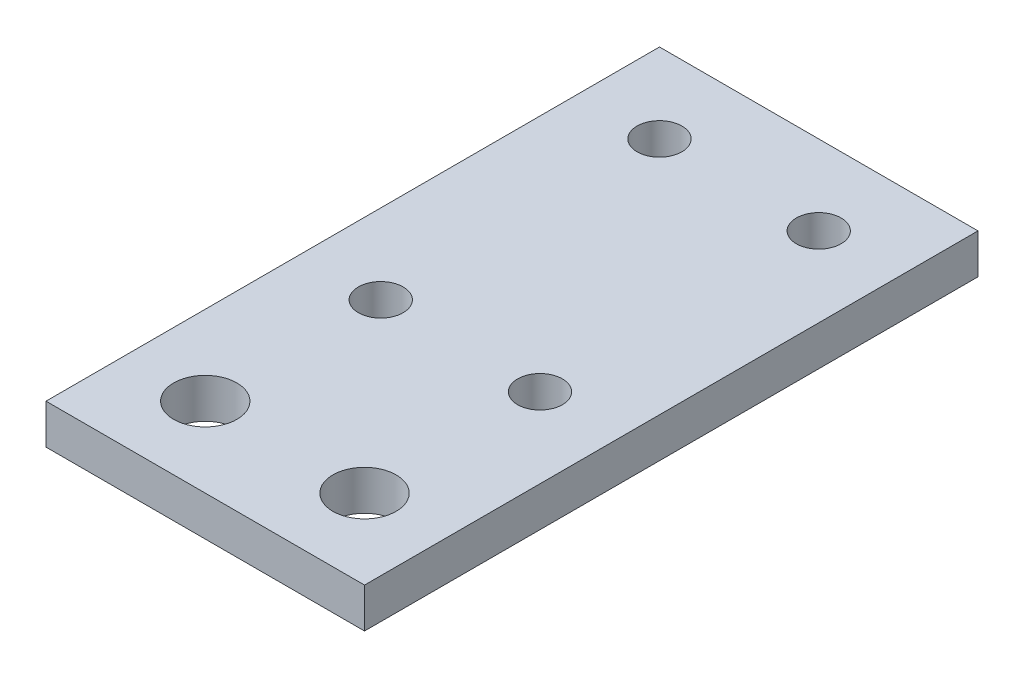
ISO-10303-21;
HEADER;
FILE_DESCRIPTION(('STEP AP214'),'2;1');
FILE_NAME('part.step','',(''),(''),'','','');
FILE_SCHEMA(('AUTOMOTIVE_DESIGN { 1 0 10303 214 1 1 1 1 }'));
ENDSEC;
DATA;
#1=APPLICATION_CONTEXT('core data for automotive mechanical design processes');
#2=APPLICATION_PROTOCOL_DEFINITION('international standard','automotive_design',2000,#1);
#3=PRODUCT_CONTEXT('',#1,'mechanical');
#4=PRODUCT('Part','Part','',(#3));
#5=PRODUCT_RELATED_PRODUCT_CATEGORY('part','',(#4));
#6=PRODUCT_DEFINITION_FORMATION('','',#4);
#7=PRODUCT_DEFINITION_CONTEXT('part definition',#1,'design');
#8=PRODUCT_DEFINITION('design','',#6,#7);
#9=PRODUCT_DEFINITION_SHAPE('','',#8);
#10=(LENGTH_UNIT() NAMED_UNIT(*) SI_UNIT(.MILLI.,.METRE.));
#11=(NAMED_UNIT(*) PLANE_ANGLE_UNIT() SI_UNIT($,.RADIAN.));
#12=(NAMED_UNIT(*) SI_UNIT($,.STERADIAN.) SOLID_ANGLE_UNIT());
#13=UNCERTAINTY_MEASURE_WITH_UNIT(LENGTH_MEASURE(1.E-05),#10,'distance_accuracy_value','');
#14=(GEOMETRIC_REPRESENTATION_CONTEXT(3) GLOBAL_UNCERTAINTY_ASSIGNED_CONTEXT((#13)) GLOBAL_UNIT_ASSIGNED_CONTEXT((#10,
#11,#12)) REPRESENTATION_CONTEXT('',''));
#15=CARTESIAN_POINT('',(0.,0.,0.));
#16=DIRECTION('',(0.,0.,1.));
#17=DIRECTION('',(1.,0.,0.));
#18=AXIS2_PLACEMENT_3D('',#15,#16,#17);
#19=CARTESIAN_POINT('',(25.4,-3.175,97.8408));
#20=DIRECTION('',(-1.,0.,0.));
#21=DIRECTION('',(0.,0.,1.));
#22=AXIS2_PLACEMENT_3D('',#19,#20,#21);
#23=PLANE('',#22);
#24=DIRECTION('',(0.,1.,0.));
#25=VECTOR('',#24,1.);
#26=CARTESIAN_POINT('',(25.4,-3.175,0.));
#27=LINE('',#26,#25);
#28=CARTESIAN_POINT('',(25.4,-3.175,0.));
#29=VERTEX_POINT('',#28);
#30=CARTESIAN_POINT('',(25.4,3.175,0.));
#31=VERTEX_POINT('',#30);
#32=EDGE_CURVE('E105',#29,#31,#27,.T.);
#33=ORIENTED_EDGE('',*,*,#32,.T.);
#34=DIRECTION('',(0.,0.,-1.));
#35=VECTOR('',#34,1.);
#36=CARTESIAN_POINT('',(25.4,3.175,97.8408));
#37=LINE('',#36,#35);
#38=CARTESIAN_POINT('',(25.4,3.175,97.8408));
#39=VERTEX_POINT('',#38);
#40=EDGE_CURVE('E11',#39,#31,#37,.T.);
#41=ORIENTED_EDGE('',*,*,#40,.F.);
#42=DIRECTION('',(0.,1.,0.));
#43=VECTOR('',#42,1.);
#44=CARTESIAN_POINT('',(25.4,-3.175,97.8408));
#45=LINE('',#44,#43);
#46=CARTESIAN_POINT('',(25.4,-3.175,97.8408));
#47=VERTEX_POINT('',#46);
#48=EDGE_CURVE('E92',#47,#39,#45,.T.);
#49=ORIENTED_EDGE('',*,*,#48,.F.);
#50=DIRECTION('',(0.,0.,-1.));
#51=VECTOR('',#50,1.);
#52=CARTESIAN_POINT('',(25.4,-3.175,97.8408));
#53=LINE('',#52,#51);
#54=EDGE_CURVE('E101',#47,#29,#53,.T.);
#55=ORIENTED_EDGE('',*,*,#54,.T.);
#56=EDGE_LOOP('',(#33,#41,#49,#55));
#57=FACE_BOUND('',#56,.T.);
#58=ADVANCED_FACE('F39',(#57),#23,.F.);
#59=CARTESIAN_POINT('',(-25.4,3.175,97.8408));
#60=DIRECTION('',(0.,-1.,0.));
#61=DIRECTION('',(0.,0.,-1.));
#62=AXIS2_PLACEMENT_3D('',#59,#60,#61);
#63=PLANE('',#62);
#64=CARTESIAN_POINT('',(-12.7,3.175,57.15));
#65=DIRECTION('',(0.,1.,0.));
#66=DIRECTION('',(0.,0.,1.));
#67=AXIS2_PLACEMENT_3D('',#64,#65,#66);
#68=CIRCLE('',#67,3.57124);
#69=CARTESIAN_POINT('',(-12.7,3.175,60.72124));
#70=VERTEX_POINT('',#69);
#71=EDGE_CURVE('E134',#70,#70,#68,.T.);
#72=ORIENTED_EDGE('',*,*,#71,.F.);
#73=EDGE_LOOP('',(#72));
#74=FACE_BOUND('',#73,.T.);
#75=CARTESIAN_POINT('',(-12.7,3.175,12.7));
#76=DIRECTION('',(0.,1.,0.));
#77=DIRECTION('',(0.,0.,1.));
#78=AXIS2_PLACEMENT_3D('',#75,#76,#77);
#79=CIRCLE('',#78,3.57124);
#80=CARTESIAN_POINT('',(-12.7,3.175,16.27124));
#81=VERTEX_POINT('',#80);
#82=EDGE_CURVE('E124',#81,#81,#79,.T.);
#83=ORIENTED_EDGE('',*,*,#82,.F.);
#84=EDGE_LOOP('',(#83));
#85=FACE_BOUND('',#84,.T.);
#86=CARTESIAN_POINT('',(-12.7,3.175,85.1408));
#87=DIRECTION('',(0.,1.,0.));
#88=DIRECTION('',(0.,0.,1.));
#89=AXIS2_PLACEMENT_3D('',#86,#87,#88);
#90=CIRCLE('',#89,5.0419);
#91=CARTESIAN_POINT('',(-12.7,3.175,90.1827));
#92=VERTEX_POINT('',#91);
#93=EDGE_CURVE('E121',#92,#92,#90,.T.);
#94=ORIENTED_EDGE('',*,*,#93,.F.);
#95=EDGE_LOOP('',(#94));
#96=FACE_BOUND('',#95,.T.);
#97=CARTESIAN_POINT('',(12.7,3.175,57.15));
#98=DIRECTION('',(0.,1.,0.));
#99=DIRECTION('',(0.,0.,1.));
#100=AXIS2_PLACEMENT_3D('',#97,#98,#99);
#101=CIRCLE('',#100,3.57124);
#102=CARTESIAN_POINT('',(12.7,3.175,60.72124));
#103=VERTEX_POINT('',#102);
#104=EDGE_CURVE('E118',#103,#103,#101,.T.);
#105=ORIENTED_EDGE('',*,*,#104,.F.);
#106=EDGE_LOOP('',(#105));
#107=FACE_BOUND('',#106,.T.);
#108=CARTESIAN_POINT('',(12.7,3.175,12.7));
#109=DIRECTION('',(0.,1.,0.));
#110=DIRECTION('',(0.,0.,1.));
#111=AXIS2_PLACEMENT_3D('',#108,#109,#110);
#112=CIRCLE('',#111,3.57124);
#113=CARTESIAN_POINT('',(12.7,3.175,16.27124));
#114=VERTEX_POINT('',#113);
#115=EDGE_CURVE('E117',#114,#114,#112,.T.);
#116=ORIENTED_EDGE('',*,*,#115,.F.);
#117=EDGE_LOOP('',(#116));
#118=FACE_BOUND('',#117,.T.);
#119=CARTESIAN_POINT('',(12.7,3.175,85.1408));
#120=DIRECTION('',(0.,1.,0.));
#121=DIRECTION('',(0.,0.,1.));
#122=AXIS2_PLACEMENT_3D('',#119,#120,#121);
#123=CIRCLE('',#122,5.0419);
#124=CARTESIAN_POINT('',(12.7,3.175,90.1827));
#125=VERTEX_POINT('',#124);
#126=EDGE_CURVE('E144',#125,#125,#123,.T.);
#127=ORIENTED_EDGE('',*,*,#126,.F.);
#128=EDGE_LOOP('',(#127));
#129=FACE_BOUND('',#128,.T.);
#130=DIRECTION('',(-1.,0.,0.));
#131=VECTOR('',#130,1.);
#132=CARTESIAN_POINT('',(-25.4,3.175,0.));
#133=LINE('',#132,#131);
#134=CARTESIAN_POINT('',(-25.4,3.175,0.));
#135=VERTEX_POINT('',#134);
#136=EDGE_CURVE('E96',#31,#135,#133,.T.);
#137=ORIENTED_EDGE('',*,*,#136,.T.);
#138=DIRECTION('',(0.,0.,-1.));
#139=VECTOR('',#138,1.);
#140=CARTESIAN_POINT('',(-25.4,3.175,97.8408));
#141=LINE('',#140,#139);
#142=CARTESIAN_POINT('',(-25.4,3.175,97.8408));
#143=VERTEX_POINT('',#142);
#144=EDGE_CURVE('E48',#143,#135,#141,.T.);
#145=ORIENTED_EDGE('',*,*,#144,.F.);
#146=DIRECTION('',(-1.,0.,0.));
#147=VECTOR('',#146,1.);
#148=CARTESIAN_POINT('',(-25.4,3.175,97.8408));
#149=LINE('',#148,#147);
#150=EDGE_CURVE('E87',#39,#143,#149,.T.);
#151=ORIENTED_EDGE('',*,*,#150,.F.);
#152=ORIENTED_EDGE('',*,*,#40,.T.);
#153=EDGE_LOOP('',(#137,#145,#151,#152));
#154=FACE_BOUND('',#153,.T.);
#155=ADVANCED_FACE('F95',(#74,#85,#96,#107,#118,#129,#154),#63,.F.);
#156=CARTESIAN_POINT('',(-25.4,-3.175,97.8408));
#157=DIRECTION('',(1.,0.,0.));
#158=DIRECTION('',(0.,0.,-1.));
#159=AXIS2_PLACEMENT_3D('',#156,#157,#158);
#160=PLANE('',#159);
#161=DIRECTION('',(0.,-1.,0.));
#162=VECTOR('',#161,1.);
#163=CARTESIAN_POINT('',(-25.4,-3.175,0.));
#164=LINE('',#163,#162);
#165=CARTESIAN_POINT('',(-25.4,-3.175,0.));
#166=VERTEX_POINT('',#165);
#167=EDGE_CURVE('E74',#135,#166,#164,.T.);
#168=ORIENTED_EDGE('',*,*,#167,.T.);
#169=DIRECTION('',(0.,0.,-1.));
#170=VECTOR('',#169,1.);
#171=CARTESIAN_POINT('',(-25.4,-3.175,97.8408));
#172=LINE('',#171,#170);
#173=CARTESIAN_POINT('',(-25.4,-3.175,97.8408));
#174=VERTEX_POINT('',#173);
#175=EDGE_CURVE('E97',#174,#166,#172,.T.);
#176=ORIENTED_EDGE('',*,*,#175,.F.);
#177=DIRECTION('',(0.,-1.,0.));
#178=VECTOR('',#177,1.);
#179=CARTESIAN_POINT('',(-25.4,-3.175,97.8408));
#180=LINE('',#179,#178);
#181=EDGE_CURVE('E90',#143,#174,#180,.T.);
#182=ORIENTED_EDGE('',*,*,#181,.F.);
#183=ORIENTED_EDGE('',*,*,#144,.T.);
#184=EDGE_LOOP('',(#168,#176,#182,#183));
#185=FACE_BOUND('',#184,.T.);
#186=ADVANCED_FACE('F99',(#185),#160,.F.);
#187=CARTESIAN_POINT('',(-25.4,-3.175,97.8408));
#188=DIRECTION('',(0.,1.,0.));
#189=DIRECTION('',(0.,0.,1.));
#190=AXIS2_PLACEMENT_3D('',#187,#188,#189);
#191=PLANE('',#190);
#192=CARTESIAN_POINT('',(-12.7,-3.175,57.15));
#193=DIRECTION('',(0.,1.,0.));
#194=DIRECTION('',(0.,0.,1.));
#195=AXIS2_PLACEMENT_3D('',#192,#193,#194);
#196=CIRCLE('',#195,3.57124);
#197=CARTESIAN_POINT('',(-12.7,-3.175,60.72124));
#198=VERTEX_POINT('',#197);
#199=EDGE_CURVE('E42',#198,#198,#196,.T.);
#200=ORIENTED_EDGE('',*,*,#199,.T.);
#201=EDGE_LOOP('',(#200));
#202=FACE_BOUND('',#201,.T.);
#203=CARTESIAN_POINT('',(-12.7,-3.175,12.7));
#204=DIRECTION('',(0.,1.,0.));
#205=DIRECTION('',(0.,0.,1.));
#206=AXIS2_PLACEMENT_3D('',#203,#204,#205);
#207=CIRCLE('',#206,3.57124);
#208=CARTESIAN_POINT('',(-12.7,-3.175,16.27124));
#209=VERTEX_POINT('',#208);
#210=EDGE_CURVE('E122',#209,#209,#207,.T.);
#211=ORIENTED_EDGE('',*,*,#210,.T.);
#212=EDGE_LOOP('',(#211));
#213=FACE_BOUND('',#212,.T.);
#214=CARTESIAN_POINT('',(-12.7,-3.175,85.1408));
#215=DIRECTION('',(0.,1.,0.));
#216=DIRECTION('',(0.,0.,1.));
#217=AXIS2_PLACEMENT_3D('',#214,#215,#216);
#218=CIRCLE('',#217,5.0419);
#219=CARTESIAN_POINT('',(-12.7,-3.175,90.1827));
#220=VERTEX_POINT('',#219);
#221=EDGE_CURVE('E119',#220,#220,#218,.T.);
#222=ORIENTED_EDGE('',*,*,#221,.T.);
#223=EDGE_LOOP('',(#222));
#224=FACE_BOUND('',#223,.T.);
#225=CARTESIAN_POINT('',(12.7,-3.175,57.15));
#226=DIRECTION('',(0.,1.,0.));
#227=DIRECTION('',(0.,0.,1.));
#228=AXIS2_PLACEMENT_3D('',#225,#226,#227);
#229=CIRCLE('',#228,3.57124);
#230=CARTESIAN_POINT('',(12.7,-3.175,60.72124));
#231=VERTEX_POINT('',#230);
#232=EDGE_CURVE('E114',#231,#231,#229,.T.);
#233=ORIENTED_EDGE('',*,*,#232,.T.);
#234=EDGE_LOOP('',(#233));
#235=FACE_BOUND('',#234,.T.);
#236=CARTESIAN_POINT('',(12.7,-3.175,12.7));
#237=DIRECTION('',(0.,1.,0.));
#238=DIRECTION('',(0.,0.,1.));
#239=AXIS2_PLACEMENT_3D('',#236,#237,#238);
#240=CIRCLE('',#239,3.57124);
#241=CARTESIAN_POINT('',(12.7,-3.175,16.27124));
#242=VERTEX_POINT('',#241);
#243=EDGE_CURVE('E141',#242,#242,#240,.T.);
#244=ORIENTED_EDGE('',*,*,#243,.T.);
#245=EDGE_LOOP('',(#244));
#246=FACE_BOUND('',#245,.T.);
#247=CARTESIAN_POINT('',(12.7,-3.175,85.1408));
#248=DIRECTION('',(0.,1.,0.));
#249=DIRECTION('',(0.,0.,1.));
#250=AXIS2_PLACEMENT_3D('',#247,#248,#249);
#251=CIRCLE('',#250,5.0419);
#252=CARTESIAN_POINT('',(12.7,-3.175,90.1827));
#253=VERTEX_POINT('',#252);
#254=EDGE_CURVE('E108',#253,#253,#251,.T.);
#255=ORIENTED_EDGE('',*,*,#254,.T.);
#256=EDGE_LOOP('',(#255));
#257=FACE_BOUND('',#256,.T.);
#258=DIRECTION('',(1.,0.,0.));
#259=VECTOR('',#258,1.);
#260=CARTESIAN_POINT('',(-25.4,-3.175,0.));
#261=LINE('',#260,#259);
#262=EDGE_CURVE('E80',#166,#29,#261,.T.);
#263=ORIENTED_EDGE('',*,*,#262,.T.);
#264=ORIENTED_EDGE('',*,*,#54,.F.);
#265=DIRECTION('',(1.,0.,0.));
#266=VECTOR('',#265,1.);
#267=CARTESIAN_POINT('',(-25.4,-3.175,97.8408));
#268=LINE('',#267,#266);
#269=EDGE_CURVE('E57',#174,#47,#268,.T.);
#270=ORIENTED_EDGE('',*,*,#269,.F.);
#271=ORIENTED_EDGE('',*,*,#175,.T.);
#272=EDGE_LOOP('',(#263,#264,#270,#271));
#273=FACE_BOUND('',#272,.T.);
#274=ADVANCED_FACE('F150',(#202,#213,#224,#235,#246,#257,#273),#191,.F.);
#275=CARTESIAN_POINT('',(25.4,3.175,97.8408));
#276=DIRECTION('',(0.,0.,-1.));
#277=DIRECTION('',(-1.,0.,0.));
#278=AXIS2_PLACEMENT_3D('',#275,#276,#277);
#279=PLANE('',#278);
#280=ORIENTED_EDGE('',*,*,#48,.T.);
#281=ORIENTED_EDGE('',*,*,#150,.T.);
#282=ORIENTED_EDGE('',*,*,#181,.T.);
#283=ORIENTED_EDGE('',*,*,#269,.T.);
#284=EDGE_LOOP('',(#280,#281,#282,#283));
#285=FACE_BOUND('',#284,.T.);
#286=ADVANCED_FACE('F88',(#285),#279,.F.);
#287=CARTESIAN_POINT('',(25.4,3.175,0.));
#288=DIRECTION('',(0.,0.,-1.));
#289=DIRECTION('',(-1.,0.,0.));
#290=AXIS2_PLACEMENT_3D('',#287,#288,#289);
#291=PLANE('',#290);
#292=ORIENTED_EDGE('',*,*,#32,.F.);
#293=ORIENTED_EDGE('',*,*,#262,.F.);
#294=ORIENTED_EDGE('',*,*,#167,.F.);
#295=ORIENTED_EDGE('',*,*,#136,.F.);
#296=EDGE_LOOP('',(#292,#293,#294,#295));
#297=FACE_BOUND('',#296,.T.);
#298=ADVANCED_FACE('F155',(#297),#291,.T.);
#299=CARTESIAN_POINT('',(12.7,3.175,85.1408));
#300=DIRECTION('',(0.,1.,0.));
#301=DIRECTION('',(0.,0.,1.));
#302=AXIS2_PLACEMENT_3D('',#299,#300,#301);
#303=CYLINDRICAL_SURFACE('',#302,5.0419);
#304=ORIENTED_EDGE('',*,*,#126,.T.);
#305=EDGE_LOOP('',(#304));
#306=FACE_BOUND('',#305,.T.);
#307=ORIENTED_EDGE('',*,*,#254,.F.);
#308=EDGE_LOOP('',(#307));
#309=FACE_BOUND('',#308,.T.);
#310=ADVANCED_FACE('F152',(#306,#309),#303,.F.);
#311=CARTESIAN_POINT('',(12.7,3.175,12.7));
#312=DIRECTION('',(0.,1.,0.));
#313=DIRECTION('',(0.,0.,1.));
#314=AXIS2_PLACEMENT_3D('',#311,#312,#313);
#315=CYLINDRICAL_SURFACE('',#314,3.57124);
#316=ORIENTED_EDGE('',*,*,#115,.T.);
#317=EDGE_LOOP('',(#316));
#318=FACE_BOUND('',#317,.T.);
#319=ORIENTED_EDGE('',*,*,#243,.F.);
#320=EDGE_LOOP('',(#319));
#321=FACE_BOUND('',#320,.T.);
#322=ADVANCED_FACE('F154',(#318,#321),#315,.F.);
#323=CARTESIAN_POINT('',(12.7,3.175,57.15));
#324=DIRECTION('',(0.,1.,0.));
#325=DIRECTION('',(0.,0.,1.));
#326=AXIS2_PLACEMENT_3D('',#323,#324,#325);
#327=CYLINDRICAL_SURFACE('',#326,3.57124);
#328=ORIENTED_EDGE('',*,*,#104,.T.);
#329=EDGE_LOOP('',(#328));
#330=FACE_BOUND('',#329,.T.);
#331=ORIENTED_EDGE('',*,*,#232,.F.);
#332=EDGE_LOOP('',(#331));
#333=FACE_BOUND('',#332,.T.);
#334=ADVANCED_FACE('F162',(#330,#333),#327,.F.);
#335=CARTESIAN_POINT('',(-12.7,3.175,85.1408));
#336=DIRECTION('',(0.,1.,0.));
#337=DIRECTION('',(0.,0.,1.));
#338=AXIS2_PLACEMENT_3D('',#335,#336,#337);
#339=CYLINDRICAL_SURFACE('',#338,5.0419);
#340=ORIENTED_EDGE('',*,*,#93,.T.);
#341=EDGE_LOOP('',(#340));
#342=FACE_BOUND('',#341,.T.);
#343=ORIENTED_EDGE('',*,*,#221,.F.);
#344=EDGE_LOOP('',(#343));
#345=FACE_BOUND('',#344,.T.);
#346=ADVANCED_FACE('F193',(#342,#345),#339,.F.);
#347=CARTESIAN_POINT('',(-12.7,3.175,12.7));
#348=DIRECTION('',(0.,1.,0.));
#349=DIRECTION('',(0.,0.,1.));
#350=AXIS2_PLACEMENT_3D('',#347,#348,#349);
#351=CYLINDRICAL_SURFACE('',#350,3.57124);
#352=ORIENTED_EDGE('',*,*,#82,.T.);
#353=EDGE_LOOP('',(#352));
#354=FACE_BOUND('',#353,.T.);
#355=ORIENTED_EDGE('',*,*,#210,.F.);
#356=EDGE_LOOP('',(#355));
#357=FACE_BOUND('',#356,.T.);
#358=ADVANCED_FACE('F199',(#354,#357),#351,.F.);
#359=CARTESIAN_POINT('',(-12.7,3.175,57.15));
#360=DIRECTION('',(0.,1.,0.));
#361=DIRECTION('',(0.,0.,1.));
#362=AXIS2_PLACEMENT_3D('',#359,#360,#361);
#363=CYLINDRICAL_SURFACE('',#362,3.57124);
#364=ORIENTED_EDGE('',*,*,#71,.T.);
#365=EDGE_LOOP('',(#364));
#366=FACE_BOUND('',#365,.T.);
#367=ORIENTED_EDGE('',*,*,#199,.F.);
#368=EDGE_LOOP('',(#367));
#369=FACE_BOUND('',#368,.T.);
#370=ADVANCED_FACE('F205',(#366,#369),#363,.F.);
#371=CLOSED_SHELL('',(#58,#155,#186,#274,#286,#298,#310,#322,#334,#346,#358,#370));
#372=MANIFOLD_SOLID_BREP('B2',#371);
#373=ADVANCED_BREP_SHAPE_REPRESENTATION('',(#18,#372),#14);
#374=SHAPE_DEFINITION_REPRESENTATION(#9,#373);
ENDSEC;
END-ISO-10303-21;
